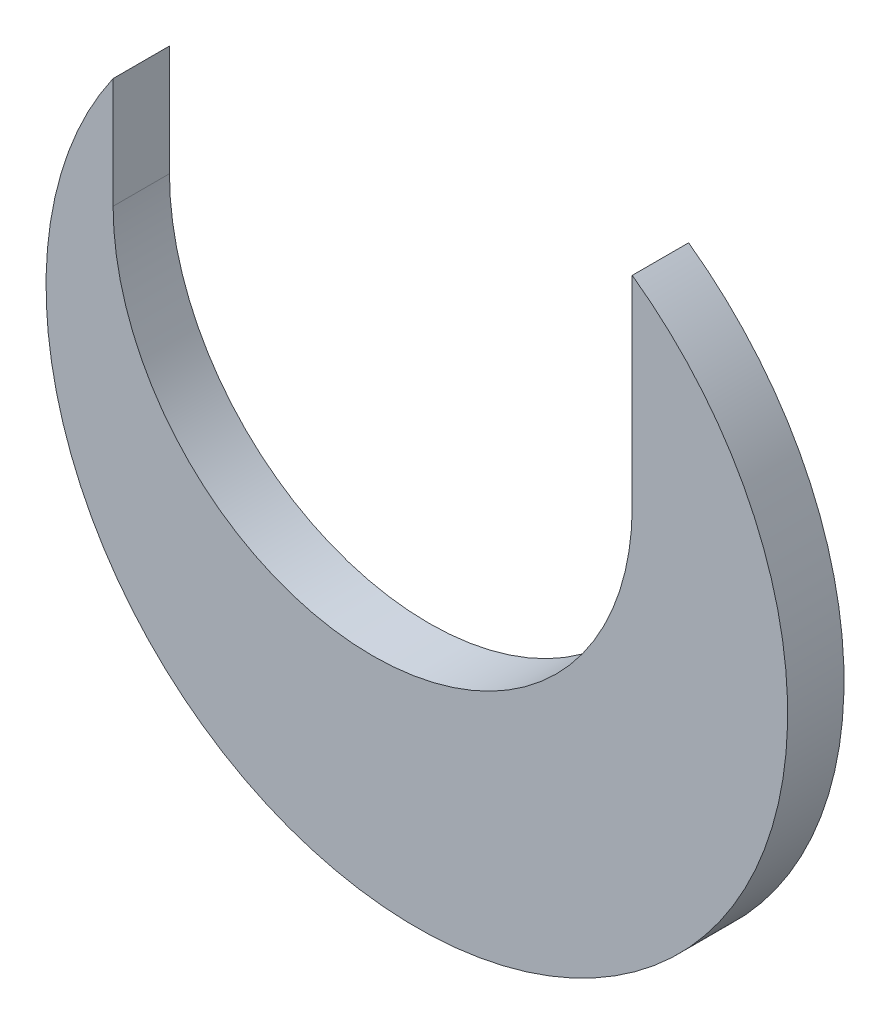
ISO-10303-21;
HEADER;
FILE_DESCRIPTION(('STEP AP214'),'2;1');
FILE_NAME('part.step','',(''),(''),'','','');
FILE_SCHEMA(('AUTOMOTIVE_DESIGN { 1 0 10303 214 1 1 1 1 }'));
ENDSEC;
DATA;
#1=APPLICATION_CONTEXT('core data for automotive mechanical design processes');
#2=APPLICATION_PROTOCOL_DEFINITION('international standard','automotive_design',2000,#1);
#3=PRODUCT_CONTEXT('',#1,'mechanical');
#4=PRODUCT('Part','Part','',(#3));
#5=PRODUCT_RELATED_PRODUCT_CATEGORY('part','',(#4));
#6=PRODUCT_DEFINITION_FORMATION('','',#4);
#7=PRODUCT_DEFINITION_CONTEXT('part definition',#1,'design');
#8=PRODUCT_DEFINITION('design','',#6,#7);
#9=PRODUCT_DEFINITION_SHAPE('','',#8);
#10=(LENGTH_UNIT() NAMED_UNIT(*) SI_UNIT(.MILLI.,.METRE.));
#11=(NAMED_UNIT(*) PLANE_ANGLE_UNIT() SI_UNIT($,.RADIAN.));
#12=(NAMED_UNIT(*) SI_UNIT($,.STERADIAN.) SOLID_ANGLE_UNIT());
#13=UNCERTAINTY_MEASURE_WITH_UNIT(LENGTH_MEASURE(1.E-05),#10,'distance_accuracy_value','');
#14=(GEOMETRIC_REPRESENTATION_CONTEXT(3) GLOBAL_UNCERTAINTY_ASSIGNED_CONTEXT((#13)) GLOBAL_UNIT_ASSIGNED_CONTEXT((#10,
#11,#12)) REPRESENTATION_CONTEXT('',''));
#15=CARTESIAN_POINT('',(0.,0.,0.));
#16=DIRECTION('',(0.,0.,1.));
#17=DIRECTION('',(1.,0.,0.));
#18=AXIS2_PLACEMENT_3D('',#15,#16,#17);
#19=CARTESIAN_POINT('',(-3.78248792687063,8.74176241287064,4.826));
#20=DIRECTION('',(0.,0.,-1.));
#21=DIRECTION('',(-1.,0.,0.));
#22=AXIS2_PLACEMENT_3D('',#19,#20,#21);
#23=CYLINDRICAL_SURFACE('',#22,22.225);
#24=CARTESIAN_POINT('',(-3.78248792687063,8.74176241287064,0.));
#25=DIRECTION('',(0.,0.,1.));
#26=DIRECTION('',(1.,0.,0.));
#27=AXIS2_PLACEMENT_3D('',#24,#25,#26);
#28=CIRCLE('',#27,22.225);
#29=CARTESIAN_POINT('',(-26.0074879268706,8.74176241287064,0.));
#30=VERTEX_POINT('',#29);
#31=CARTESIAN_POINT('',(18.4425120731294,8.74176241287064,0.));
#32=VERTEX_POINT('',#31);
#33=EDGE_CURVE('E98',#30,#32,#28,.T.);
#34=ORIENTED_EDGE('',*,*,#33,.F.);
#35=DIRECTION('',(0.,0.,-1.));
#36=VECTOR('',#35,1.);
#37=CARTESIAN_POINT('',(-26.0074879268706,8.74176241287064,4.826));
#38=LINE('',#37,#36);
#39=CARTESIAN_POINT('',(-26.0074879268706,8.74176241287064,4.826));
#40=VERTEX_POINT('',#39);
#41=EDGE_CURVE('E11',#40,#30,#38,.T.);
#42=ORIENTED_EDGE('',*,*,#41,.F.);
#43=CARTESIAN_POINT('',(-3.78248792687063,8.74176241287064,4.826));
#44=DIRECTION('',(0.,0.,1.));
#45=DIRECTION('',(1.,0.,0.));
#46=AXIS2_PLACEMENT_3D('',#43,#44,#45);
#47=CIRCLE('',#46,22.225);
#48=CARTESIAN_POINT('',(18.4425120731294,8.74176241287064,4.826));
#49=VERTEX_POINT('',#48);
#50=EDGE_CURVE('E83',#40,#49,#47,.T.);
#51=ORIENTED_EDGE('',*,*,#50,.T.);
#52=DIRECTION('',(0.,0.,-1.));
#53=VECTOR('',#52,1.);
#54=CARTESIAN_POINT('',(18.4425120731294,8.74176241287064,4.826));
#55=LINE('',#54,#53);
#56=EDGE_CURVE('E51',#49,#32,#55,.T.);
#57=ORIENTED_EDGE('',*,*,#56,.T.);
#58=EDGE_LOOP('',(#34,#42,#51,#57));
#59=FACE_BOUND('',#58,.T.);
#60=ADVANCED_FACE('F35',(#59),#23,.F.);
#61=CARTESIAN_POINT('',(-26.0074879268706,0.,4.826));
#62=DIRECTION('',(-1.,0.,0.));
#63=DIRECTION('',(0.,0.,1.));
#64=AXIS2_PLACEMENT_3D('',#61,#62,#63);
#65=PLANE('',#64);
#66=DIRECTION('',(0.,1.,0.));
#67=VECTOR('',#66,1.);
#68=CARTESIAN_POINT('',(-26.0074879268706,0.,0.));
#69=LINE('',#68,#67);
#70=CARTESIAN_POINT('',(-26.0074879268706,18.2118936888419,0.));
#71=VERTEX_POINT('',#70);
#72=EDGE_CURVE('E89',#30,#71,#69,.T.);
#73=ORIENTED_EDGE('',*,*,#72,.T.);
#74=DIRECTION('',(0.,0.,-1.));
#75=VECTOR('',#74,1.);
#76=CARTESIAN_POINT('',(-26.0074879268706,18.2118936888419,4.826));
#77=LINE('',#76,#75);
#78=CARTESIAN_POINT('',(-26.0074879268706,18.2118936888419,4.826));
#79=VERTEX_POINT('',#78);
#80=EDGE_CURVE('E43',#79,#71,#77,.T.);
#81=ORIENTED_EDGE('',*,*,#80,.F.);
#82=DIRECTION('',(0.,1.,0.));
#83=VECTOR('',#82,1.);
#84=CARTESIAN_POINT('',(-26.0074879268706,0.,4.826));
#85=LINE('',#84,#83);
#86=EDGE_CURVE('E77',#40,#79,#85,.T.);
#87=ORIENTED_EDGE('',*,*,#86,.F.);
#88=ORIENTED_EDGE('',*,*,#41,.T.);
#89=EDGE_LOOP('',(#73,#81,#87,#88));
#90=FACE_BOUND('',#89,.T.);
#91=ADVANCED_FACE('F87',(#90),#65,.F.);
#92=CARTESIAN_POINT('',(0.,0.,4.826));
#93=DIRECTION('',(0.,0.,-1.));
#94=DIRECTION('',(-1.,0.,0.));
#95=AXIS2_PLACEMENT_3D('',#92,#93,#94);
#96=CYLINDRICAL_SURFACE('',#95,31.75);
#97=CARTESIAN_POINT('',(0.,0.,0.));
#98=DIRECTION('',(0.,0.,1.));
#99=DIRECTION('',(1.,0.,0.));
#100=AXIS2_PLACEMENT_3D('',#97,#98,#99);
#101=CIRCLE('',#100,31.75);
#102=CARTESIAN_POINT('',(18.4425120731294,25.8444626261116,0.));
#103=VERTEX_POINT('',#102);
#104=EDGE_CURVE('E101',#71,#103,#101,.T.);
#105=ORIENTED_EDGE('',*,*,#104,.T.);
#106=DIRECTION('',(0.,0.,-1.));
#107=VECTOR('',#106,1.);
#108=CARTESIAN_POINT('',(18.4425120731294,25.8444626261116,4.826));
#109=LINE('',#108,#107);
#110=CARTESIAN_POINT('',(18.4425120731294,25.8444626261116,4.826));
#111=VERTEX_POINT('',#110);
#112=EDGE_CURVE('E65',#111,#103,#109,.T.);
#113=ORIENTED_EDGE('',*,*,#112,.F.);
#114=CARTESIAN_POINT('',(0.,0.,4.826));
#115=DIRECTION('',(0.,0.,1.));
#116=DIRECTION('',(1.,0.,0.));
#117=AXIS2_PLACEMENT_3D('',#114,#115,#116);
#118=CIRCLE('',#117,31.75);
#119=EDGE_CURVE('E82',#79,#111,#118,.T.);
#120=ORIENTED_EDGE('',*,*,#119,.F.);
#121=ORIENTED_EDGE('',*,*,#80,.T.);
#122=EDGE_LOOP('',(#105,#113,#120,#121));
#123=FACE_BOUND('',#122,.T.);
#124=ADVANCED_FACE('F92',(#123),#96,.T.);
#125=CARTESIAN_POINT('',(18.4425120731294,0.,4.826));
#126=DIRECTION('',(-1.,0.,0.));
#127=DIRECTION('',(0.,0.,1.));
#128=AXIS2_PLACEMENT_3D('',#125,#126,#127);
#129=PLANE('',#128);
#130=DIRECTION('',(0.,1.,0.));
#131=VECTOR('',#130,1.);
#132=CARTESIAN_POINT('',(18.4425120731294,0.,0.));
#133=LINE('',#132,#131);
#134=EDGE_CURVE('E103',#32,#103,#133,.T.);
#135=ORIENTED_EDGE('',*,*,#134,.F.);
#136=ORIENTED_EDGE('',*,*,#56,.F.);
#137=DIRECTION('',(0.,1.,0.));
#138=VECTOR('',#137,1.);
#139=CARTESIAN_POINT('',(18.4425120731294,0.,4.826));
#140=LINE('',#139,#138);
#141=EDGE_CURVE('E93',#49,#111,#140,.T.);
#142=ORIENTED_EDGE('',*,*,#141,.T.);
#143=ORIENTED_EDGE('',*,*,#112,.T.);
#144=EDGE_LOOP('',(#135,#136,#142,#143));
#145=FACE_BOUND('',#144,.T.);
#146=ADVANCED_FACE('F108',(#145),#129,.T.);
#147=CARTESIAN_POINT('',(0.,0.,4.826));
#148=DIRECTION('',(0.,0.,1.));
#149=DIRECTION('',(1.,0.,0.));
#150=AXIS2_PLACEMENT_3D('',#147,#148,#149);
#151=PLANE('',#150);
#152=ORIENTED_EDGE('',*,*,#50,.F.);
#153=ORIENTED_EDGE('',*,*,#86,.T.);
#154=ORIENTED_EDGE('',*,*,#119,.T.);
#155=ORIENTED_EDGE('',*,*,#141,.F.);
#156=EDGE_LOOP('',(#152,#153,#154,#155));
#157=FACE_BOUND('',#156,.T.);
#158=ADVANCED_FACE('F79',(#157),#151,.T.);
#159=CARTESIAN_POINT('',(0.,0.,0.));
#160=DIRECTION('',(0.,0.,1.));
#161=DIRECTION('',(1.,0.,0.));
#162=AXIS2_PLACEMENT_3D('',#159,#160,#161);
#163=PLANE('',#162);
#164=ORIENTED_EDGE('',*,*,#33,.T.);
#165=ORIENTED_EDGE('',*,*,#134,.T.);
#166=ORIENTED_EDGE('',*,*,#104,.F.);
#167=ORIENTED_EDGE('',*,*,#72,.F.);
#168=EDGE_LOOP('',(#164,#165,#166,#167));
#169=FACE_BOUND('',#168,.T.);
#170=ADVANCED_FACE('F115',(#169),#163,.F.);
#171=CLOSED_SHELL('',(#60,#91,#124,#146,#158,#170));
#172=MANIFOLD_SOLID_BREP('B2',#171);
#173=ADVANCED_BREP_SHAPE_REPRESENTATION('',(#18,#172),#14);
#174=SHAPE_DEFINITION_REPRESENTATION(#9,#173);
ENDSEC;
END-ISO-10303-21;
